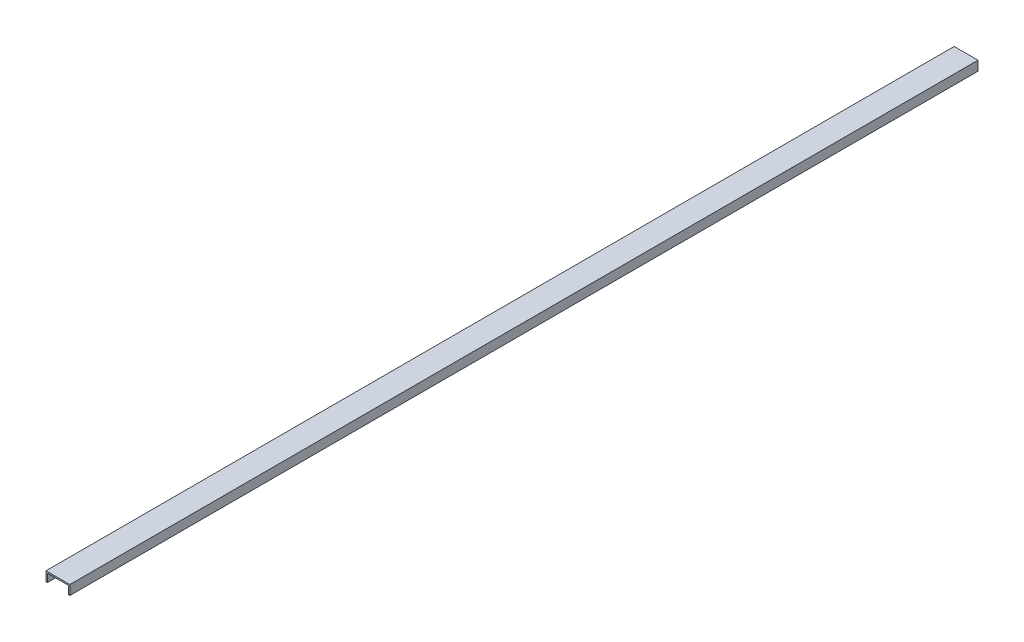
ISO-10303-21;
HEADER;
FILE_DESCRIPTION(('STEP AP214'),'2;1');
FILE_NAME('part.step','',(''),(''),'','','');
FILE_SCHEMA(('AUTOMOTIVE_DESIGN { 1 0 10303 214 1 1 1 1 }'));
ENDSEC;
DATA;
#1=APPLICATION_CONTEXT('core data for automotive mechanical design processes');
#2=APPLICATION_PROTOCOL_DEFINITION('international standard','automotive_design',2000,#1);
#3=PRODUCT_CONTEXT('',#1,'mechanical');
#4=PRODUCT('Part','Part','',(#3));
#5=PRODUCT_RELATED_PRODUCT_CATEGORY('part','',(#4));
#6=PRODUCT_DEFINITION_FORMATION('','',#4);
#7=PRODUCT_DEFINITION_CONTEXT('part definition',#1,'design');
#8=PRODUCT_DEFINITION('design','',#6,#7);
#9=PRODUCT_DEFINITION_SHAPE('','',#8);
#10=(LENGTH_UNIT() NAMED_UNIT(*) SI_UNIT(.MILLI.,.METRE.));
#11=(NAMED_UNIT(*) PLANE_ANGLE_UNIT() SI_UNIT($,.RADIAN.));
#12=(NAMED_UNIT(*) SI_UNIT($,.STERADIAN.) SOLID_ANGLE_UNIT());
#13=UNCERTAINTY_MEASURE_WITH_UNIT(LENGTH_MEASURE(1.E-05),#10,'distance_accuracy_value','');
#14=(GEOMETRIC_REPRESENTATION_CONTEXT(3) GLOBAL_UNCERTAINTY_ASSIGNED_CONTEXT((#13)) GLOBAL_UNIT_ASSIGNED_CONTEXT((#10,
#11,#12)) REPRESENTATION_CONTEXT('',''));
#15=CARTESIAN_POINT('',(0.,0.,0.));
#16=DIRECTION('',(0.,0.,1.));
#17=DIRECTION('',(1.,0.,0.));
#18=AXIS2_PLACEMENT_3D('',#15,#16,#17);
#19=CARTESIAN_POINT('',(3.,0.,1785.));
#20=DIRECTION('',(0.,1.,0.));
#21=DIRECTION('',(-1.,0.,0.));
#22=AXIS2_PLACEMENT_3D('',#19,#20,#21);
#23=PLANE('',#22);
#24=DIRECTION('',(0.,0.,-1.));
#25=VECTOR('',#24,1.);
#26=CARTESIAN_POINT('',(0.,0.,1785.));
#27=LINE('',#26,#25);
#28=CARTESIAN_POINT('',(0.,0.,1845.));
#29=VERTEX_POINT('',#28);
#30=CARTESIAN_POINT('',(0.,0.,-60.));
#31=VERTEX_POINT('',#30);
#32=EDGE_CURVE('E47',#29,#31,#27,.T.);
#33=ORIENTED_EDGE('',*,*,#32,.T.);
#34=DIRECTION('',(-1.,0.,0.));
#35=VECTOR('',#34,1.);
#36=CARTESIAN_POINT('',(0.,0.,-60.));
#37=LINE('',#36,#35);
#38=CARTESIAN_POINT('',(3.,0.,-60.));
#39=VERTEX_POINT('',#38);
#40=EDGE_CURVE('E130',#39,#31,#37,.T.);
#41=ORIENTED_EDGE('',*,*,#40,.F.);
#42=DIRECTION('',(0.,0.,-1.));
#43=VECTOR('',#42,1.);
#44=CARTESIAN_POINT('',(3.,0.,1785.));
#45=LINE('',#44,#43);
#46=CARTESIAN_POINT('',(3.,0.,1845.));
#47=VERTEX_POINT('',#46);
#48=EDGE_CURVE('E11',#47,#39,#45,.T.);
#49=ORIENTED_EDGE('',*,*,#48,.F.);
#50=DIRECTION('',(1.,0.,0.));
#51=VECTOR('',#50,1.);
#52=CARTESIAN_POINT('',(3.,0.,1845.));
#53=LINE('',#52,#51);
#54=EDGE_CURVE('E139',#29,#47,#53,.T.);
#55=ORIENTED_EDGE('',*,*,#54,.F.);
#56=EDGE_LOOP('',(#33,#41,#49,#55));
#57=FACE_BOUND('',#56,.T.);
#58=ADVANCED_FACE('F33',(#57),#23,.F.);
#59=CARTESIAN_POINT('',(2.99999999999999,17.,1785.));
#60=DIRECTION('',(-1.,0.,0.));
#61=DIRECTION('',(0.,-1.,0.));
#62=AXIS2_PLACEMENT_3D('',#59,#60,#61);
#63=PLANE('',#62);
#64=ORIENTED_EDGE('',*,*,#48,.T.);
#65=DIRECTION('',(0.,-1.,0.));
#66=VECTOR('',#65,1.);
#67=CARTESIAN_POINT('',(3.,0.,-60.));
#68=LINE('',#67,#66);
#69=CARTESIAN_POINT('',(2.99999999999999,17.,-60.));
#70=VERTEX_POINT('',#69);
#71=EDGE_CURVE('E127',#70,#39,#68,.T.);
#72=ORIENTED_EDGE('',*,*,#71,.F.);
#73=DIRECTION('',(0.,0.,-1.));
#74=VECTOR('',#73,1.);
#75=CARTESIAN_POINT('',(2.99999999999999,17.,1785.));
#76=LINE('',#75,#74);
#77=CARTESIAN_POINT('',(2.99999999999999,17.,1845.));
#78=VERTEX_POINT('',#77);
#79=EDGE_CURVE('E40',#78,#70,#76,.T.);
#80=ORIENTED_EDGE('',*,*,#79,.F.);
#81=DIRECTION('',(0.,1.,0.));
#82=VECTOR('',#81,1.);
#83=CARTESIAN_POINT('',(2.99999999999999,17.,1845.));
#84=LINE('',#83,#82);
#85=EDGE_CURVE('E142',#47,#78,#84,.T.);
#86=ORIENTED_EDGE('',*,*,#85,.F.);
#87=EDGE_LOOP('',(#64,#72,#80,#86));
#88=FACE_BOUND('',#87,.T.);
#89=ADVANCED_FACE('F170',(#88),#63,.F.);
#90=CARTESIAN_POINT('',(47.,17.,1785.));
#91=DIRECTION('',(0.,1.,0.));
#92=DIRECTION('',(-1.,0.,0.));
#93=AXIS2_PLACEMENT_3D('',#90,#91,#92);
#94=PLANE('',#93);
#95=ORIENTED_EDGE('',*,*,#79,.T.);
#96=DIRECTION('',(-1.,0.,0.));
#97=VECTOR('',#96,1.);
#98=CARTESIAN_POINT('',(2.99999999999999,17.,-60.));
#99=LINE('',#98,#97);
#100=CARTESIAN_POINT('',(47.,17.,-60.));
#101=VERTEX_POINT('',#100);
#102=EDGE_CURVE('E117',#101,#70,#99,.T.);
#103=ORIENTED_EDGE('',*,*,#102,.F.);
#104=DIRECTION('',(0.,0.,-1.));
#105=VECTOR('',#104,1.);
#106=CARTESIAN_POINT('',(47.,17.,1785.));
#107=LINE('',#106,#105);
#108=CARTESIAN_POINT('',(47.,17.,1845.));
#109=VERTEX_POINT('',#108);
#110=EDGE_CURVE('E108',#109,#101,#107,.T.);
#111=ORIENTED_EDGE('',*,*,#110,.F.);
#112=DIRECTION('',(1.,0.,0.));
#113=VECTOR('',#112,1.);
#114=CARTESIAN_POINT('',(47.,17.,1845.));
#115=LINE('',#114,#113);
#116=EDGE_CURVE('E145',#78,#109,#115,.T.);
#117=ORIENTED_EDGE('',*,*,#116,.F.);
#118=EDGE_LOOP('',(#95,#103,#111,#117));
#119=FACE_BOUND('',#118,.T.);
#120=ADVANCED_FACE('F165',(#119),#94,.F.);
#121=CARTESIAN_POINT('',(47.,0.,1785.));
#122=DIRECTION('',(1.,0.,0.));
#123=DIRECTION('',(0.,0.,-1.));
#124=AXIS2_PLACEMENT_3D('',#121,#122,#123);
#125=PLANE('',#124);
#126=ORIENTED_EDGE('',*,*,#110,.T.);
#127=DIRECTION('',(0.,1.,0.));
#128=VECTOR('',#127,1.);
#129=CARTESIAN_POINT('',(47.,17.,-60.));
#130=LINE('',#129,#128);
#131=CARTESIAN_POINT('',(47.,0.,-60.));
#132=VERTEX_POINT('',#131);
#133=EDGE_CURVE('E112',#132,#101,#130,.T.);
#134=ORIENTED_EDGE('',*,*,#133,.F.);
#135=DIRECTION('',(0.,0.,-1.));
#136=VECTOR('',#135,1.);
#137=CARTESIAN_POINT('',(47.,0.,1785.));
#138=LINE('',#137,#136);
#139=CARTESIAN_POINT('',(47.,0.,1845.));
#140=VERTEX_POINT('',#139);
#141=EDGE_CURVE('E98',#140,#132,#138,.T.);
#142=ORIENTED_EDGE('',*,*,#141,.F.);
#143=DIRECTION('',(0.,-1.,0.));
#144=VECTOR('',#143,1.);
#145=CARTESIAN_POINT('',(47.,0.,1845.));
#146=LINE('',#145,#144);
#147=EDGE_CURVE('E148',#109,#140,#146,.T.);
#148=ORIENTED_EDGE('',*,*,#147,.F.);
#149=EDGE_LOOP('',(#126,#134,#142,#148));
#150=FACE_BOUND('',#149,.T.);
#151=ADVANCED_FACE('F113',(#150),#125,.F.);
#152=CARTESIAN_POINT('',(50.,0.,1785.));
#153=DIRECTION('',(0.,1.,0.));
#154=DIRECTION('',(-1.,0.,0.));
#155=AXIS2_PLACEMENT_3D('',#152,#153,#154);
#156=PLANE('',#155);
#157=ORIENTED_EDGE('',*,*,#141,.T.);
#158=DIRECTION('',(-1.,0.,0.));
#159=VECTOR('',#158,1.);
#160=CARTESIAN_POINT('',(47.,0.,-60.));
#161=LINE('',#160,#159);
#162=CARTESIAN_POINT('',(50.,0.,-60.));
#163=VERTEX_POINT('',#162);
#164=EDGE_CURVE('E102',#163,#132,#161,.T.);
#165=ORIENTED_EDGE('',*,*,#164,.F.);
#166=DIRECTION('',(0.,0.,-1.));
#167=VECTOR('',#166,1.);
#168=CARTESIAN_POINT('',(50.,0.,1785.));
#169=LINE('',#168,#167);
#170=CARTESIAN_POINT('',(50.,0.,1845.));
#171=VERTEX_POINT('',#170);
#172=EDGE_CURVE('E109',#171,#163,#169,.T.);
#173=ORIENTED_EDGE('',*,*,#172,.F.);
#174=DIRECTION('',(1.,0.,0.));
#175=VECTOR('',#174,1.);
#176=CARTESIAN_POINT('',(50.,0.,1845.));
#177=LINE('',#176,#175);
#178=EDGE_CURVE('E104',#140,#171,#177,.T.);
#179=ORIENTED_EDGE('',*,*,#178,.F.);
#180=EDGE_LOOP('',(#157,#165,#173,#179));
#181=FACE_BOUND('',#180,.T.);
#182=ADVANCED_FACE('F100',(#181),#156,.F.);
#183=CARTESIAN_POINT('',(50.,20.,1785.));
#184=DIRECTION('',(-1.,0.,0.));
#185=DIRECTION('',(0.,0.,1.));
#186=AXIS2_PLACEMENT_3D('',#183,#184,#185);
#187=PLANE('',#186);
#188=ORIENTED_EDGE('',*,*,#172,.T.);
#189=DIRECTION('',(0.,-1.,0.));
#190=VECTOR('',#189,1.);
#191=CARTESIAN_POINT('',(50.,0.,-60.));
#192=LINE('',#191,#190);
#193=CARTESIAN_POINT('',(50.,20.,-60.));
#194=VERTEX_POINT('',#193);
#195=EDGE_CURVE('E123',#194,#163,#192,.T.);
#196=ORIENTED_EDGE('',*,*,#195,.F.);
#197=DIRECTION('',(0.,0.,-1.));
#198=VECTOR('',#197,1.);
#199=CARTESIAN_POINT('',(50.,20.,1785.));
#200=LINE('',#199,#198);
#201=CARTESIAN_POINT('',(50.,20.,1845.));
#202=VERTEX_POINT('',#201);
#203=EDGE_CURVE('E160',#202,#194,#200,.T.);
#204=ORIENTED_EDGE('',*,*,#203,.F.);
#205=DIRECTION('',(0.,1.,0.));
#206=VECTOR('',#205,1.);
#207=CARTESIAN_POINT('',(50.,20.,1845.));
#208=LINE('',#207,#206);
#209=EDGE_CURVE('E151',#171,#202,#208,.T.);
#210=ORIENTED_EDGE('',*,*,#209,.F.);
#211=EDGE_LOOP('',(#188,#196,#204,#210));
#212=FACE_BOUND('',#211,.T.);
#213=ADVANCED_FACE('F179',(#212),#187,.F.);
#214=CARTESIAN_POINT('',(0.,20.,1785.));
#215=DIRECTION('',(0.,-1.,0.));
#216=DIRECTION('',(0.,0.,-1.));
#217=AXIS2_PLACEMENT_3D('',#214,#215,#216);
#218=PLANE('',#217);
#219=ORIENTED_EDGE('',*,*,#203,.T.);
#220=DIRECTION('',(1.,0.,0.));
#221=VECTOR('',#220,1.);
#222=CARTESIAN_POINT('',(50.,20.,-60.));
#223=LINE('',#222,#221);
#224=CARTESIAN_POINT('',(0.,20.,-60.));
#225=VERTEX_POINT('',#224);
#226=EDGE_CURVE('E136',#225,#194,#223,.T.);
#227=ORIENTED_EDGE('',*,*,#226,.F.);
#228=DIRECTION('',(0.,0.,-1.));
#229=VECTOR('',#228,1.);
#230=CARTESIAN_POINT('',(0.,20.,1785.));
#231=LINE('',#230,#229);
#232=CARTESIAN_POINT('',(0.,20.,1845.));
#233=VERTEX_POINT('',#232);
#234=EDGE_CURVE('E55',#233,#225,#231,.T.);
#235=ORIENTED_EDGE('',*,*,#234,.F.);
#236=DIRECTION('',(-1.,0.,0.));
#237=VECTOR('',#236,1.);
#238=CARTESIAN_POINT('',(0.,20.,1845.));
#239=LINE('',#238,#237);
#240=EDGE_CURVE('E154',#202,#233,#239,.T.);
#241=ORIENTED_EDGE('',*,*,#240,.F.);
#242=EDGE_LOOP('',(#219,#227,#235,#241));
#243=FACE_BOUND('',#242,.T.);
#244=ADVANCED_FACE('F177',(#243),#218,.F.);
#245=CARTESIAN_POINT('',(0.,0.,1785.));
#246=DIRECTION('',(1.,0.,0.));
#247=DIRECTION('',(0.,0.,-1.));
#248=AXIS2_PLACEMENT_3D('',#245,#246,#247);
#249=PLANE('',#248);
#250=ORIENTED_EDGE('',*,*,#234,.T.);
#251=DIRECTION('',(0.,1.,0.));
#252=VECTOR('',#251,1.);
#253=CARTESIAN_POINT('',(0.,20.,-60.));
#254=LINE('',#253,#252);
#255=EDGE_CURVE('E133',#31,#225,#254,.T.);
#256=ORIENTED_EDGE('',*,*,#255,.F.);
#257=ORIENTED_EDGE('',*,*,#32,.F.);
#258=DIRECTION('',(0.,-1.,0.));
#259=VECTOR('',#258,1.);
#260=CARTESIAN_POINT('',(0.,0.,1845.));
#261=LINE('',#260,#259);
#262=EDGE_CURVE('E156',#233,#29,#261,.T.);
#263=ORIENTED_EDGE('',*,*,#262,.F.);
#264=EDGE_LOOP('',(#250,#256,#257,#263));
#265=FACE_BOUND('',#264,.T.);
#266=ADVANCED_FACE('F173',(#265),#249,.F.);
#267=CARTESIAN_POINT('',(0.,0.,1845.));
#268=DIRECTION('',(0.,0.,-1.));
#269=DIRECTION('',(-1.,0.,0.));
#270=AXIS2_PLACEMENT_3D('',#267,#268,#269);
#271=PLANE('',#270);
#272=ORIENTED_EDGE('',*,*,#54,.T.);
#273=ORIENTED_EDGE('',*,*,#85,.T.);
#274=ORIENTED_EDGE('',*,*,#116,.T.);
#275=ORIENTED_EDGE('',*,*,#147,.T.);
#276=ORIENTED_EDGE('',*,*,#178,.T.);
#277=ORIENTED_EDGE('',*,*,#209,.T.);
#278=ORIENTED_EDGE('',*,*,#240,.T.);
#279=ORIENTED_EDGE('',*,*,#262,.T.);
#280=EDGE_LOOP('',(#272,#273,#274,#275,#276,#277,#278,#279));
#281=FACE_BOUND('',#280,.T.);
#282=ADVANCED_FACE('F175',(#281),#271,.F.);
#283=CARTESIAN_POINT('',(0.,0.,-60.));
#284=DIRECTION('',(0.,0.,1.));
#285=DIRECTION('',(1.,0.,0.));
#286=AXIS2_PLACEMENT_3D('',#283,#284,#285);
#287=PLANE('',#286);
#288=ORIENTED_EDGE('',*,*,#164,.T.);
#289=ORIENTED_EDGE('',*,*,#133,.T.);
#290=ORIENTED_EDGE('',*,*,#102,.T.);
#291=ORIENTED_EDGE('',*,*,#71,.T.);
#292=ORIENTED_EDGE('',*,*,#40,.T.);
#293=ORIENTED_EDGE('',*,*,#255,.T.);
#294=ORIENTED_EDGE('',*,*,#226,.T.);
#295=ORIENTED_EDGE('',*,*,#195,.T.);
#296=EDGE_LOOP('',(#288,#289,#290,#291,#292,#293,#294,#295));
#297=FACE_BOUND('',#296,.T.);
#298=ADVANCED_FACE('F120',(#297),#287,.F.);
#299=CLOSED_SHELL('',(#58,#89,#120,#151,#182,#213,#244,#266,#282,#298));
#300=MANIFOLD_SOLID_BREP('B2',#299);
#301=ADVANCED_BREP_SHAPE_REPRESENTATION('',(#18,#300),#14);
#302=SHAPE_DEFINITION_REPRESENTATION(#9,#301);
ENDSEC;
END-ISO-10303-21;
